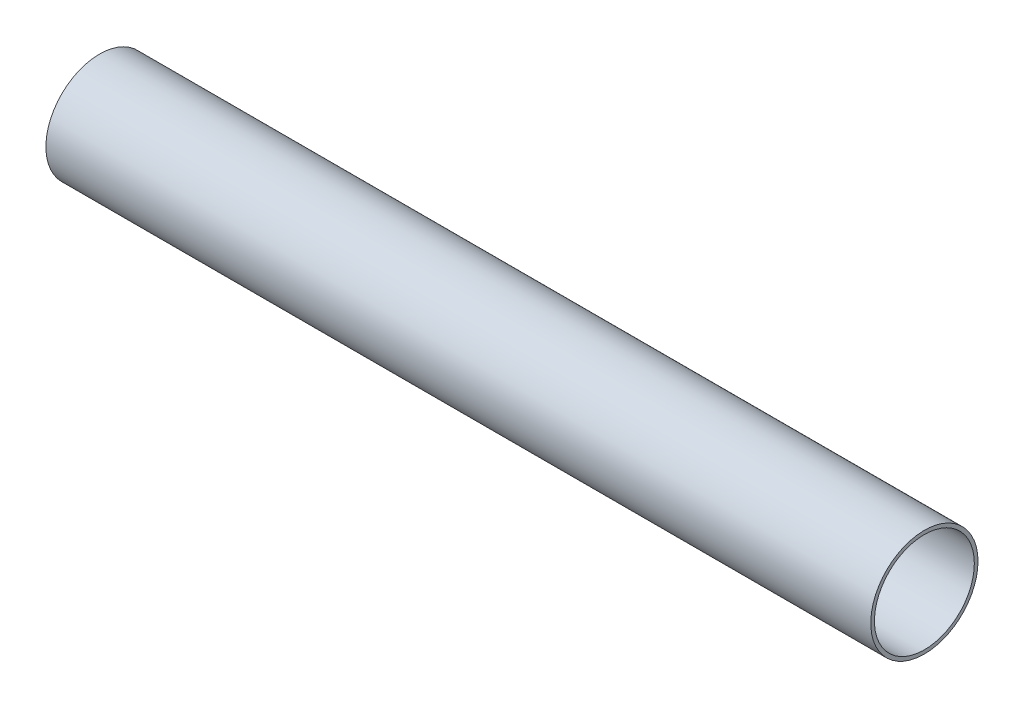
ISO-10303-21;
HEADER;
FILE_DESCRIPTION(('STEP AP214'),'2;1');
FILE_NAME('part.step','',(''),(''),'','','');
FILE_SCHEMA(('AUTOMOTIVE_DESIGN { 1 0 10303 214 1 1 1 1 }'));
ENDSEC;
DATA;
#1=APPLICATION_CONTEXT('core data for automotive mechanical design processes');
#2=APPLICATION_PROTOCOL_DEFINITION('international standard','automotive_design',2000,#1);
#3=PRODUCT_CONTEXT('',#1,'mechanical');
#4=PRODUCT('Part','Part','',(#3));
#5=PRODUCT_RELATED_PRODUCT_CATEGORY('part','',(#4));
#6=PRODUCT_DEFINITION_FORMATION('','',#4);
#7=PRODUCT_DEFINITION_CONTEXT('part definition',#1,'design');
#8=PRODUCT_DEFINITION('design','',#6,#7);
#9=PRODUCT_DEFINITION_SHAPE('','',#8);
#10=(LENGTH_UNIT() NAMED_UNIT(*) SI_UNIT(.MILLI.,.METRE.));
#11=(NAMED_UNIT(*) PLANE_ANGLE_UNIT() SI_UNIT($,.RADIAN.));
#12=(NAMED_UNIT(*) SI_UNIT($,.STERADIAN.) SOLID_ANGLE_UNIT());
#13=UNCERTAINTY_MEASURE_WITH_UNIT(LENGTH_MEASURE(1.E-05),#10,'distance_accuracy_value','');
#14=(GEOMETRIC_REPRESENTATION_CONTEXT(3) GLOBAL_UNCERTAINTY_ASSIGNED_CONTEXT((#13)) GLOBAL_UNIT_ASSIGNED_CONTEXT((#10,
#11,#12)) REPRESENTATION_CONTEXT('',''));
#15=CARTESIAN_POINT('',(0.,0.,0.));
#16=DIRECTION('',(0.,0.,1.));
#17=DIRECTION('',(1.,0.,0.));
#18=AXIS2_PLACEMENT_3D('',#15,#16,#17);
#19=CARTESIAN_POINT('',(500.,-10.0874029854113,22.2708897080508));
#20=DIRECTION('',(1.,0.,0.));
#21=DIRECTION('',(0.,0.,-1.));
#22=AXIS2_PLACEMENT_3D('',#19,#20,#21);
#23=PLANE('',#22);
#24=CARTESIAN_POINT('',(500.,-10.0874029854113,22.2708897080508));
#25=DIRECTION('',(1.,0.,0.));
#26=DIRECTION('',(0.,0.,-1.));
#27=AXIS2_PLACEMENT_3D('',#24,#25,#26);
#28=CIRCLE('',#27,32.5);
#29=CARTESIAN_POINT('',(500.,-10.0874029854113,-10.2291102919492));
#30=VERTEX_POINT('',#29);
#31=EDGE_CURVE('E10',#30,#30,#28,.T.);
#32=ORIENTED_EDGE('',*,*,#31,.T.);
#33=EDGE_LOOP('',(#32));
#34=FACE_BOUND('',#33,.T.);
#35=CARTESIAN_POINT('',(500.,-10.0874029854113,22.2708897080508));
#36=DIRECTION('',(1.,0.,0.));
#37=DIRECTION('',(0.,0.,-1.));
#38=AXIS2_PLACEMENT_3D('',#35,#36,#37);
#39=CIRCLE('',#38,30.275);
#40=CARTESIAN_POINT('',(500.,-10.0874029854113,-8.00411029194915));
#41=VERTEX_POINT('',#40);
#42=EDGE_CURVE('E45',#41,#41,#39,.T.);
#43=ORIENTED_EDGE('',*,*,#42,.F.);
#44=EDGE_LOOP('',(#43));
#45=FACE_BOUND('',#44,.T.);
#46=ADVANCED_FACE('F34',(#34,#45),#23,.T.);
#47=CARTESIAN_POINT('',(0.,-10.0874029854113,22.2708897080508));
#48=DIRECTION('',(1.,0.,0.));
#49=DIRECTION('',(0.,0.,-1.));
#50=AXIS2_PLACEMENT_3D('',#47,#48,#49);
#51=PLANE('',#50);
#52=CARTESIAN_POINT('',(0.,-10.0874029854113,22.2708897080508));
#53=DIRECTION('',(1.,0.,0.));
#54=DIRECTION('',(0.,0.,-1.));
#55=AXIS2_PLACEMENT_3D('',#52,#53,#54);
#56=CIRCLE('',#55,32.5);
#57=CARTESIAN_POINT('',(0.,-10.0874029854113,-10.2291102919492));
#58=VERTEX_POINT('',#57);
#59=EDGE_CURVE('E38',#58,#58,#56,.T.);
#60=ORIENTED_EDGE('',*,*,#59,.F.);
#61=EDGE_LOOP('',(#60));
#62=FACE_BOUND('',#61,.T.);
#63=CARTESIAN_POINT('',(0.,-10.0874029854113,22.2708897080508));
#64=DIRECTION('',(1.,0.,0.));
#65=DIRECTION('',(0.,0.,-1.));
#66=AXIS2_PLACEMENT_3D('',#63,#64,#65);
#67=CIRCLE('',#66,30.275);
#68=CARTESIAN_POINT('',(0.,-10.0874029854113,-8.00411029194915));
#69=VERTEX_POINT('',#68);
#70=EDGE_CURVE('E47',#69,#69,#67,.T.);
#71=ORIENTED_EDGE('',*,*,#70,.T.);
#72=EDGE_LOOP('',(#71));
#73=FACE_BOUND('',#72,.T.);
#74=ADVANCED_FACE('F57',(#62,#73),#51,.F.);
#75=CARTESIAN_POINT('',(500.,-10.0874029854113,22.2708897080508));
#76=DIRECTION('',(-1.,0.,0.));
#77=DIRECTION('',(0.,0.,1.));
#78=AXIS2_PLACEMENT_3D('',#75,#76,#77);
#79=CYLINDRICAL_SURFACE('',#78,32.5);
#80=ORIENTED_EDGE('',*,*,#31,.F.);
#81=EDGE_LOOP('',(#80));
#82=FACE_BOUND('',#81,.T.);
#83=ORIENTED_EDGE('',*,*,#59,.T.);
#84=EDGE_LOOP('',(#83));
#85=FACE_BOUND('',#84,.T.);
#86=ADVANCED_FACE('F36',(#82,#85),#79,.T.);
#87=CARTESIAN_POINT('',(500.,-10.0874029854113,22.2708897080508));
#88=DIRECTION('',(-1.,0.,0.));
#89=DIRECTION('',(0.,0.,1.));
#90=AXIS2_PLACEMENT_3D('',#87,#88,#89);
#91=CYLINDRICAL_SURFACE('',#90,30.275);
#92=ORIENTED_EDGE('',*,*,#42,.T.);
#93=EDGE_LOOP('',(#92));
#94=FACE_BOUND('',#93,.T.);
#95=ORIENTED_EDGE('',*,*,#70,.F.);
#96=EDGE_LOOP('',(#95));
#97=FACE_BOUND('',#96,.T.);
#98=ADVANCED_FACE('F53',(#94,#97),#91,.F.);
#99=CLOSED_SHELL('',(#46,#74,#86,#98));
#100=MANIFOLD_SOLID_BREP('B2',#99);
#101=ADVANCED_BREP_SHAPE_REPRESENTATION('',(#18,#100),#14);
#102=SHAPE_DEFINITION_REPRESENTATION(#9,#101);
ENDSEC;
END-ISO-10303-21;
